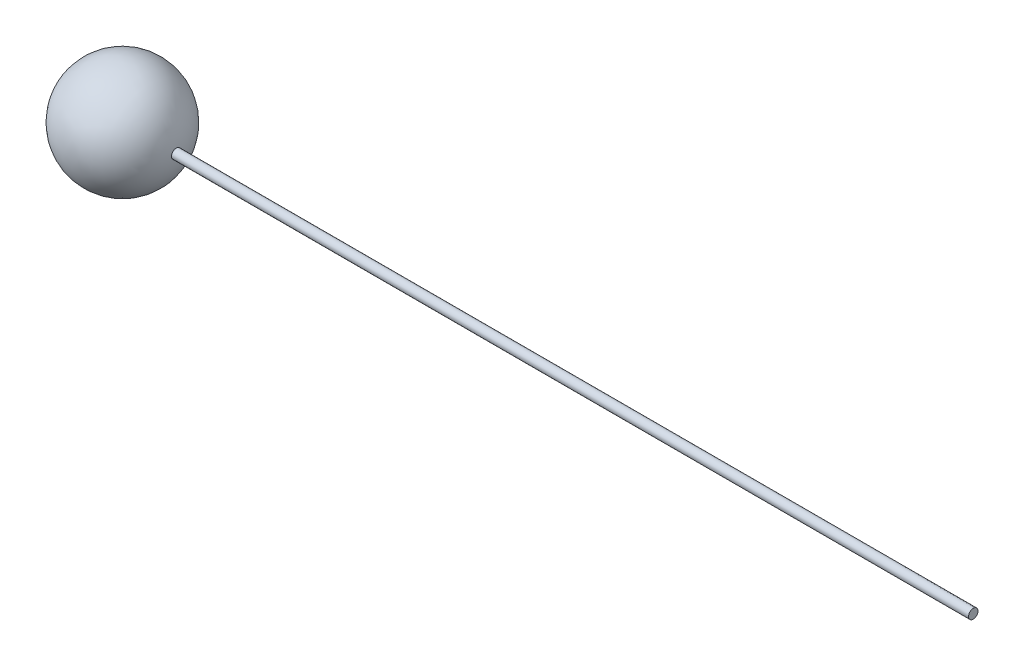
ISO-10303-21;
HEADER;
FILE_DESCRIPTION(('STEP AP214'),'2;1');
FILE_NAME('part.step','',(''),(''),'','','');
FILE_SCHEMA(('AUTOMOTIVE_DESIGN { 1 0 10303 214 1 1 1 1 }'));
ENDSEC;
DATA;
#1=APPLICATION_CONTEXT('core data for automotive mechanical design processes');
#2=APPLICATION_PROTOCOL_DEFINITION('international standard','automotive_design',2000,#1);
#3=PRODUCT_CONTEXT('',#1,'mechanical');
#4=PRODUCT('Part','Part','',(#3));
#5=PRODUCT_RELATED_PRODUCT_CATEGORY('part','',(#4));
#6=PRODUCT_DEFINITION_FORMATION('','',#4);
#7=PRODUCT_DEFINITION_CONTEXT('part definition',#1,'design');
#8=PRODUCT_DEFINITION('design','',#6,#7);
#9=PRODUCT_DEFINITION_SHAPE('','',#8);
#10=(LENGTH_UNIT() NAMED_UNIT(*) SI_UNIT(.MILLI.,.METRE.));
#11=(NAMED_UNIT(*) PLANE_ANGLE_UNIT() SI_UNIT($,.RADIAN.));
#12=(NAMED_UNIT(*) SI_UNIT($,.STERADIAN.) SOLID_ANGLE_UNIT());
#13=UNCERTAINTY_MEASURE_WITH_UNIT(LENGTH_MEASURE(1.E-05),#10,'distance_accuracy_value','');
#14=(GEOMETRIC_REPRESENTATION_CONTEXT(3) GLOBAL_UNCERTAINTY_ASSIGNED_CONTEXT((#13)) GLOBAL_UNIT_ASSIGNED_CONTEXT((#10,
#11,#12)) REPRESENTATION_CONTEXT('',''));
#15=CARTESIAN_POINT('',(0.,0.,0.));
#16=DIRECTION('',(0.,0.,1.));
#17=DIRECTION('',(1.,0.,0.));
#18=AXIS2_PLACEMENT_3D('',#15,#16,#17);
#19=CARTESIAN_POINT('',(0.,0.,0.));
#20=DIRECTION('',(0.,1.,0.));
#21=DIRECTION('',(1.,0.,0.));
#22=AXIS2_PLACEMENT_3D('',#19,#20,#21);
#23=SPHERICAL_SURFACE('',#22,114.3);
#24=CARTESIAN_POINT('',(0.,0.,0.));
#25=DIRECTION('',(-1.,0.,0.));
#26=DIRECTION('',(0.,0.,1.));
#27=AXIS2_PLACEMENT_3D('',#24,#25,#26);
#28=SPHERICAL_SURFACE('',#27,114.3);
#29=CARTESIAN_POINT('',(113.861714373182,0.,0.));
#30=DIRECTION('',(-1.,0.,0.));
#31=DIRECTION('',(0.,0.,1.));
#32=AXIS2_PLACEMENT_3D('',#29,#30,#31);
#33=CIRCLE('',#32,10.);
#34=CARTESIAN_POINT('',(113.861714373182,0.,10.));
#35=VERTEX_POINT('',#34);
#36=EDGE_CURVE('E10',#35,#35,#33,.F.);
#37=ORIENTED_EDGE('',*,*,#36,.F.);
#38=EDGE_LOOP('',(#37));
#39=FACE_BOUND('',#38,.T.);
#40=ADVANCED_FACE('F33',(#39),#28,.T.);
#41=CARTESIAN_POINT('',(0.,0.,0.));
#42=DIRECTION('',(-1.,0.,0.));
#43=DIRECTION('',(0.,0.,1.));
#44=AXIS2_PLACEMENT_3D('',#41,#42,#43);
#45=CYLINDRICAL_SURFACE('',#44,10.);
#46=ORIENTED_EDGE('',*,*,#36,.T.);
#47=EDGE_LOOP('',(#46));
#48=FACE_BOUND('',#47,.T.);
#49=CARTESIAN_POINT('',(1800.,0.,0.));
#50=DIRECTION('',(-1.,0.,0.));
#51=DIRECTION('',(0.,0.,1.));
#52=AXIS2_PLACEMENT_3D('',#49,#50,#51);
#53=CIRCLE('',#52,10.);
#54=CARTESIAN_POINT('',(1800.,0.,10.));
#55=VERTEX_POINT('',#54);
#56=EDGE_CURVE('E39',#55,#55,#53,.T.);
#57=ORIENTED_EDGE('',*,*,#56,.T.);
#58=EDGE_LOOP('',(#57));
#59=FACE_BOUND('',#58,.T.);
#60=ADVANCED_FACE('F45',(#48,#59),#45,.T.);
#61=CARTESIAN_POINT('',(1800.,0.,0.));
#62=DIRECTION('',(-1.,0.,0.));
#63=DIRECTION('',(0.,0.,1.));
#64=AXIS2_PLACEMENT_3D('',#61,#62,#63);
#65=PLANE('',#64);
#66=ORIENTED_EDGE('',*,*,#56,.F.);
#67=EDGE_LOOP('',(#66));
#68=FACE_BOUND('',#67,.T.);
#69=ADVANCED_FACE('F47',(#68),#65,.F.);
#70=CLOSED_SHELL('',(#40,#60,#69));
#71=MANIFOLD_SOLID_BREP('B2',#70);
#72=ADVANCED_BREP_SHAPE_REPRESENTATION('',(#18,#71),#14);
#73=SHAPE_DEFINITION_REPRESENTATION(#9,#72);
ENDSEC;
END-ISO-10303-21;
